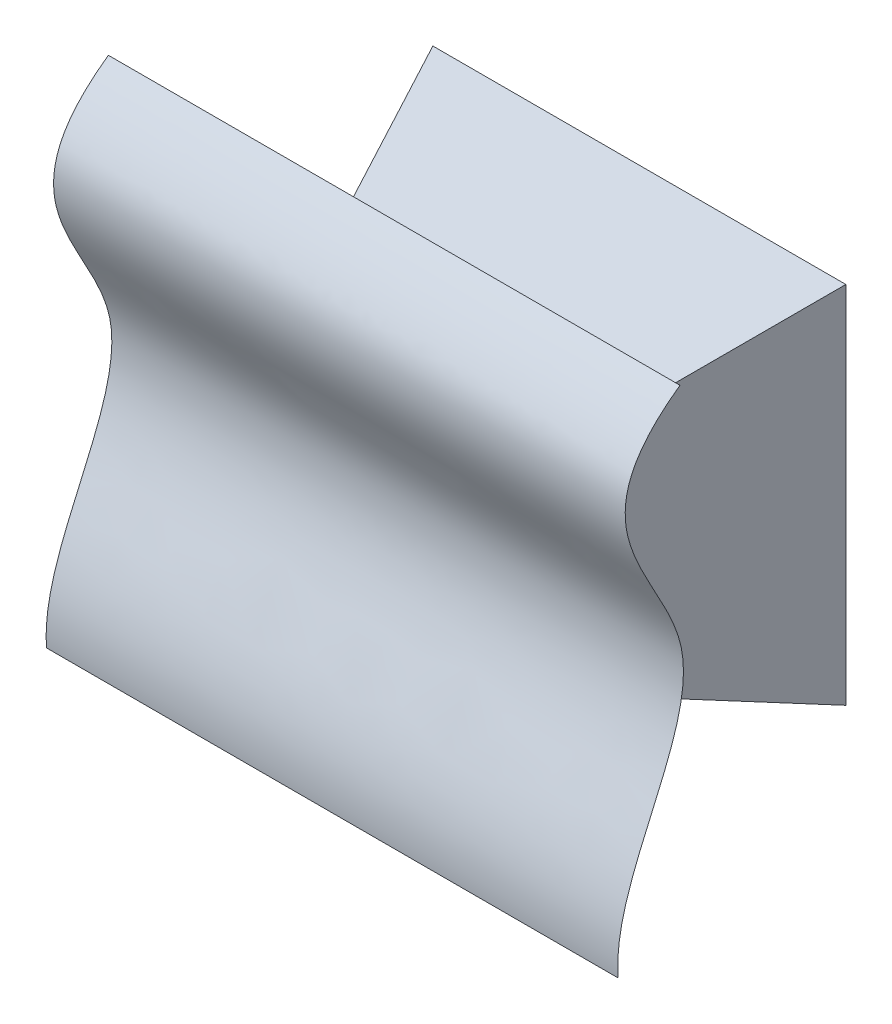
ISO-10303-21;
HEADER;
FILE_DESCRIPTION(('STEP AP214'),'2;1');
FILE_NAME('part.step','',(''),(''),'','','');
FILE_SCHEMA(('AUTOMOTIVE_DESIGN { 1 0 10303 214 1 1 1 1 }'));
ENDSEC;
DATA;
#1=APPLICATION_CONTEXT('core data for automotive mechanical design processes');
#2=APPLICATION_PROTOCOL_DEFINITION('international standard','automotive_design',2000,#1);
#3=PRODUCT_CONTEXT('',#1,'mechanical');
#4=PRODUCT('Part','Part','',(#3));
#5=PRODUCT_RELATED_PRODUCT_CATEGORY('part','',(#4));
#6=PRODUCT_DEFINITION_FORMATION('','',#4);
#7=PRODUCT_DEFINITION_CONTEXT('part definition',#1,'design');
#8=PRODUCT_DEFINITION('design','',#6,#7);
#9=PRODUCT_DEFINITION_SHAPE('','',#8);
#10=(LENGTH_UNIT() NAMED_UNIT(*) SI_UNIT(.MILLI.,.METRE.));
#11=(NAMED_UNIT(*) PLANE_ANGLE_UNIT() SI_UNIT($,.RADIAN.));
#12=(NAMED_UNIT(*) SI_UNIT($,.STERADIAN.) SOLID_ANGLE_UNIT());
#13=UNCERTAINTY_MEASURE_WITH_UNIT(LENGTH_MEASURE(1.E-05),#10,'distance_accuracy_value','');
#14=(GEOMETRIC_REPRESENTATION_CONTEXT(3) GLOBAL_UNCERTAINTY_ASSIGNED_CONTEXT((#13)) GLOBAL_UNIT_ASSIGNED_CONTEXT((#10,
#11,#12)) REPRESENTATION_CONTEXT('',''));
#15=CARTESIAN_POINT('',(0.,0.,0.));
#16=DIRECTION('',(0.,0.,1.));
#17=DIRECTION('',(1.,0.,0.));
#18=AXIS2_PLACEMENT_3D('',#15,#16,#17);
#19=CARTESIAN_POINT('',(0.,6.18998145234106,24.0617093417306));
#20=CARTESIAN_POINT('',(0.,-2.51743336554624,36.3175386797677));
#21=CARTESIAN_POINT('',(0.,-17.8971138640143,13.7833225384035));
#22=CARTESIAN_POINT('',(0.,-35.3189451877222,31.3158734977249));
#23=CARTESIAN_POINT('',(0.,-44.4496945571311,30.5449896612824));
#24=B_SPLINE_CURVE_WITH_KNOTS('',3,(#19,#20,#21,#22,#23),.UNSPECIFIED.,.F.,.F.,(4,1,4),(0.,
0.484609084090598,1.),.UNSPECIFIED.);
#25=DIRECTION('',(1.,0.,0.));
#26=VECTOR('',#25,1.);
#27=SURFACE_OF_LINEAR_EXTRUSION('',#24,#26);
#28=CARTESIAN_POINT('',(50.,6.18998145234106,24.0617093417306));
#29=CARTESIAN_POINT('',(50.,-2.51743336554624,36.3175386797677));
#30=CARTESIAN_POINT('',(50.,-17.8971138640143,13.7833225384035));
#31=CARTESIAN_POINT('',(50.,-35.3189451877222,31.3158734977249));
#32=CARTESIAN_POINT('',(50.,-44.4496945571311,30.5449896612824));
#33=B_SPLINE_CURVE_WITH_KNOTS('',3,(#28,#29,#30,#31,#32),.UNSPECIFIED.,.F.,.F.,(4,1,4),(0.,
0.484609084090598,1.),.UNSPECIFIED.);
#34=CARTESIAN_POINT('',(50.,6.18998145234106,24.0617093417306));
#35=VERTEX_POINT('',#34);
#36=CARTESIAN_POINT('',(50.,-44.4496945571311,30.5449896612824));
#37=VERTEX_POINT('',#36);
#38=EDGE_CURVE('E57',#35,#37,#33,.T.);
#39=ORIENTED_EDGE('',*,*,#38,.F.);
#40=DIRECTION('',(1.,0.,0.));
#41=VECTOR('',#40,1.);
#42=CARTESIAN_POINT('',(0.,6.18998145234106,24.0617093417306));
#43=LINE('',#42,#41);
#44=CARTESIAN_POINT('',(-10.,6.18998145234106,24.0617093417306));
#45=VERTEX_POINT('',#44);
#46=EDGE_CURVE('E49',#45,#35,#43,.T.);
#47=ORIENTED_EDGE('',*,*,#46,.F.);
#48=CARTESIAN_POINT('',(-10.,6.18998145234106,24.0617093417306));
#49=CARTESIAN_POINT('',(-10.,-2.51743336554624,36.3175386797677));
#50=CARTESIAN_POINT('',(-10.,-17.8971138640143,13.7833225384035));
#51=CARTESIAN_POINT('',(-10.,-35.3189451877222,31.3158734977249));
#52=CARTESIAN_POINT('',(-10.,-44.4496945571311,30.5449896612824));
#53=B_SPLINE_CURVE_WITH_KNOTS('',3,(#48,#49,#50,#51,#52),.UNSPECIFIED.,.F.,.F.,(4,1,4),(0.,
0.484609084090598,1.),.UNSPECIFIED.);
#54=CARTESIAN_POINT('',(-10.,-44.4496945571311,30.5449896612824));
#55=VERTEX_POINT('',#54);
#56=EDGE_CURVE('E67',#45,#55,#53,.T.);
#57=ORIENTED_EDGE('',*,*,#56,.T.);
#58=DIRECTION('',(1.,0.,0.));
#59=VECTOR('',#58,1.);
#60=CARTESIAN_POINT('',(0.,-44.4496945571311,30.5449896612824));
#61=LINE('',#60,#59);
#62=EDGE_CURVE('E12',#55,#37,#61,.T.);
#63=ORIENTED_EDGE('',*,*,#62,.T.);
#64=EDGE_LOOP('',(#39,#47,#57,#63));
#65=FACE_BOUND('',#64,.T.);
#66=ADVANCED_FACE('F47',(#65),#27,.T.);
#67=OPEN_SHELL('',(#66));
#68=SHELL_BASED_SURFACE_MODEL('B2',(#67));
#69=CARTESIAN_POINT('',(0.,0.,0.));
#70=DIRECTION('',(-0.939692620785908,0.,0.342020143325669));
#71=DIRECTION('',(0.342020143325669,0.,0.939692620785908));
#72=AXIS2_PLACEMENT_3D('',#69,#70,#71);
#73=PLANE('',#72);
#74=DIRECTION('',(0.,-1.,0.));
#75=VECTOR('',#74,1.);
#76=CARTESIAN_POINT('',(0.,0.,0.));
#77=LINE('',#76,#75);
#78=CARTESIAN_POINT('',(0.,0.,0.));
#79=VERTEX_POINT('',#78);
#80=CARTESIAN_POINT('',(0.,-38.2597131047897,0.));
#81=VERTEX_POINT('',#80);
#82=EDGE_CURVE('E154',#79,#81,#77,.T.);
#83=ORIENTED_EDGE('',*,*,#82,.T.);
#84=DIRECTION('',(-0.323615577118185,-0.323615577118185,-0.889126490715988));
#85=VECTOR('',#84,1.);
#86=CARTESIAN_POINT('',(0.,-38.2597131047897,0.));
#87=LINE('',#86,#85);
#88=CARTESIAN_POINT('',(7.27940468532406,-30.9803084194656,20.));
#89=VERTEX_POINT('',#88);
#90=EDGE_CURVE('E45',#89,#81,#87,.T.);
#91=ORIENTED_EDGE('',*,*,#90,.F.);
#92=DIRECTION('',(0.,1.,0.));
#93=VECTOR('',#92,1.);
#94=CARTESIAN_POINT('',(7.27940468532406,0.,20.));
#95=LINE('',#94,#93);
#96=CARTESIAN_POINT('',(7.27940468532406,-7.27940468532406,20.));
#97=VERTEX_POINT('',#96);
#98=EDGE_CURVE('E170',#97,#89,#95,.F.);
#99=ORIENTED_EDGE('',*,*,#98,.F.);
#100=DIRECTION('',(-0.323615577118185,0.323615577118185,-0.889126490715988));
#101=VECTOR('',#100,1.);
#102=CARTESIAN_POINT('',(0.,0.,0.));
#103=LINE('',#102,#101);
#104=EDGE_CURVE('E165',#97,#79,#103,.T.);
#105=ORIENTED_EDGE('',*,*,#104,.T.);
#106=EDGE_LOOP('',(#83,#91,#99,#105));
#107=FACE_BOUND('',#106,.T.);
#108=ADVANCED_FACE('F108',(#107),#73,.T.);
#109=CARTESIAN_POINT('',(0.,-38.2597131047897,0.));
#110=DIRECTION('',(0.,-0.939692620785908,0.342020143325669));
#111=DIRECTION('',(0.,-0.342020143325669,-0.939692620785908));
#112=AXIS2_PLACEMENT_3D('',#109,#110,#111);
#113=PLANE('',#112);
#114=DIRECTION('',(1.,0.,0.));
#115=VECTOR('',#114,1.);
#116=CARTESIAN_POINT('',(0.,-38.2597131047897,0.));
#117=LINE('',#116,#115);
#118=CARTESIAN_POINT('',(43.3507233163141,-38.2597131047897,0.));
#119=VERTEX_POINT('',#118);
#120=EDGE_CURVE('E150',#81,#119,#117,.T.);
#121=ORIENTED_EDGE('',*,*,#120,.T.);
#122=DIRECTION('',(0.323615577118185,-0.323615577118185,-0.889126490715988));
#123=VECTOR('',#122,1.);
#124=CARTESIAN_POINT('',(39.3438967445105,-34.2528865329861,11.0086655297012));
#125=LINE('',#124,#123);
#126=CARTESIAN_POINT('',(36.0713186309901,-30.9803084194656,20.));
#127=VERTEX_POINT('',#126);
#128=EDGE_CURVE('E117',#127,#119,#125,.T.);
#129=ORIENTED_EDGE('',*,*,#128,.F.);
#130=DIRECTION('',(-1.,0.,0.));
#131=VECTOR('',#130,1.);
#132=CARTESIAN_POINT('',(0.,-30.9803084194656,20.));
#133=LINE('',#132,#131);
#134=EDGE_CURVE('E161',#89,#127,#133,.F.);
#135=ORIENTED_EDGE('',*,*,#134,.F.);
#136=ORIENTED_EDGE('',*,*,#90,.T.);
#137=EDGE_LOOP('',(#121,#129,#135,#136));
#138=FACE_BOUND('',#137,.T.);
#139=ADVANCED_FACE('F110',(#138),#113,.T.);
#140=CARTESIAN_POINT('',(43.3507233163141,0.,0.));
#141=DIRECTION('',(0.939692620785908,0.,0.342020143325669));
#142=DIRECTION('',(0.342020143325669,0.,-0.939692620785908));
#143=AXIS2_PLACEMENT_3D('',#140,#141,#142);
#144=PLANE('',#143);
#145=DIRECTION('',(0.,1.,0.));
#146=VECTOR('',#145,1.);
#147=CARTESIAN_POINT('',(43.3507233163141,0.,0.));
#148=LINE('',#147,#146);
#149=CARTESIAN_POINT('',(43.3507233163141,0.,0.));
#150=VERTEX_POINT('',#149);
#151=EDGE_CURVE('E155',#119,#150,#148,.T.);
#152=ORIENTED_EDGE('',*,*,#151,.T.);
#153=DIRECTION('',(0.323615577118185,0.323615577118185,-0.889126490715988));
#154=VECTOR('',#153,1.);
#155=CARTESIAN_POINT('',(38.8107303055205,-4.53999301079362,12.4735282816372));
#156=LINE('',#155,#154);
#157=CARTESIAN_POINT('',(36.0713186309901,-7.27940468532406,20.));
#158=VERTEX_POINT('',#157);
#159=EDGE_CURVE('E173',#158,#150,#156,.T.);
#160=ORIENTED_EDGE('',*,*,#159,.F.);
#161=DIRECTION('',(0.,-1.,0.));
#162=VECTOR('',#161,1.);
#163=CARTESIAN_POINT('',(36.0713186309901,0.,20.));
#164=LINE('',#163,#162);
#165=EDGE_CURVE('E129',#127,#158,#164,.F.);
#166=ORIENTED_EDGE('',*,*,#165,.F.);
#167=ORIENTED_EDGE('',*,*,#128,.T.);
#168=EDGE_LOOP('',(#152,#160,#166,#167));
#169=FACE_BOUND('',#168,.T.);
#170=ADVANCED_FACE('F180',(#169),#144,.T.);
#171=CARTESIAN_POINT('',(0.,0.,0.));
#172=DIRECTION('',(0.,0.939692620785908,0.342020143325669));
#173=DIRECTION('',(0.,-0.342020143325669,0.939692620785908));
#174=AXIS2_PLACEMENT_3D('',#171,#172,#173);
#175=PLANE('',#174);
#176=DIRECTION('',(-1.,0.,0.));
#177=VECTOR('',#176,1.);
#178=CARTESIAN_POINT('',(0.,0.,0.));
#179=LINE('',#178,#177);
#180=EDGE_CURVE('E169',#150,#79,#179,.T.);
#181=ORIENTED_EDGE('',*,*,#180,.T.);
#182=ORIENTED_EDGE('',*,*,#104,.F.);
#183=DIRECTION('',(1.,0.,0.));
#184=VECTOR('',#183,1.);
#185=CARTESIAN_POINT('',(0.,-7.27940468532406,20.));
#186=LINE('',#185,#184);
#187=EDGE_CURVE('E112',#158,#97,#186,.F.);
#188=ORIENTED_EDGE('',*,*,#187,.F.);
#189=ORIENTED_EDGE('',*,*,#159,.T.);
#190=EDGE_LOOP('',(#181,#182,#188,#189));
#191=FACE_BOUND('',#190,.T.);
#192=ADVANCED_FACE('F182',(#191),#175,.T.);
#193=CARTESIAN_POINT('',(0.,0.,20.));
#194=DIRECTION('',(0.,0.,1.));
#195=DIRECTION('',(1.,0.,0.));
#196=AXIS2_PLACEMENT_3D('',#193,#194,#195);
#197=PLANE('',#196);
#198=ORIENTED_EDGE('',*,*,#98,.T.);
#199=ORIENTED_EDGE('',*,*,#134,.T.);
#200=ORIENTED_EDGE('',*,*,#165,.T.);
#201=ORIENTED_EDGE('',*,*,#187,.T.);
#202=EDGE_LOOP('',(#198,#199,#200,#201));
#203=FACE_BOUND('',#202,.T.);
#204=ADVANCED_FACE('F178',(#203),#197,.T.);
#205=CARTESIAN_POINT('',(0.,0.,0.));
#206=DIRECTION('',(0.,0.,1.));
#207=DIRECTION('',(1.,0.,0.));
#208=AXIS2_PLACEMENT_3D('',#205,#206,#207);
#209=PLANE('',#208);
#210=ORIENTED_EDGE('',*,*,#82,.F.);
#211=ORIENTED_EDGE('',*,*,#180,.F.);
#212=ORIENTED_EDGE('',*,*,#151,.F.);
#213=ORIENTED_EDGE('',*,*,#120,.F.);
#214=EDGE_LOOP('',(#210,#211,#212,#213));
#215=FACE_BOUND('',#214,.T.);
#216=ADVANCED_FACE('F151',(#215),#209,.F.);
#217=CLOSED_SHELL('',(#108,#139,#170,#192,#204,#216));
#218=MANIFOLD_SOLID_BREP('B6',#217);
#219=ADVANCED_BREP_SHAPE_REPRESENTATION('',(#18,#218),#14);
#220=MANIFOLD_SURFACE_SHAPE_REPRESENTATION('',(#18,#68),#14);
#221=SHAPE_REPRESENTATION('',(#18),#14);
#222=SHAPE_DEFINITION_REPRESENTATION(#9,#221);
#223=SHAPE_REPRESENTATION_RELATIONSHIP('','',#221,#219);
#224=SHAPE_REPRESENTATION_RELATIONSHIP('','',#221,#220);
ENDSEC;
END-ISO-10303-21;
